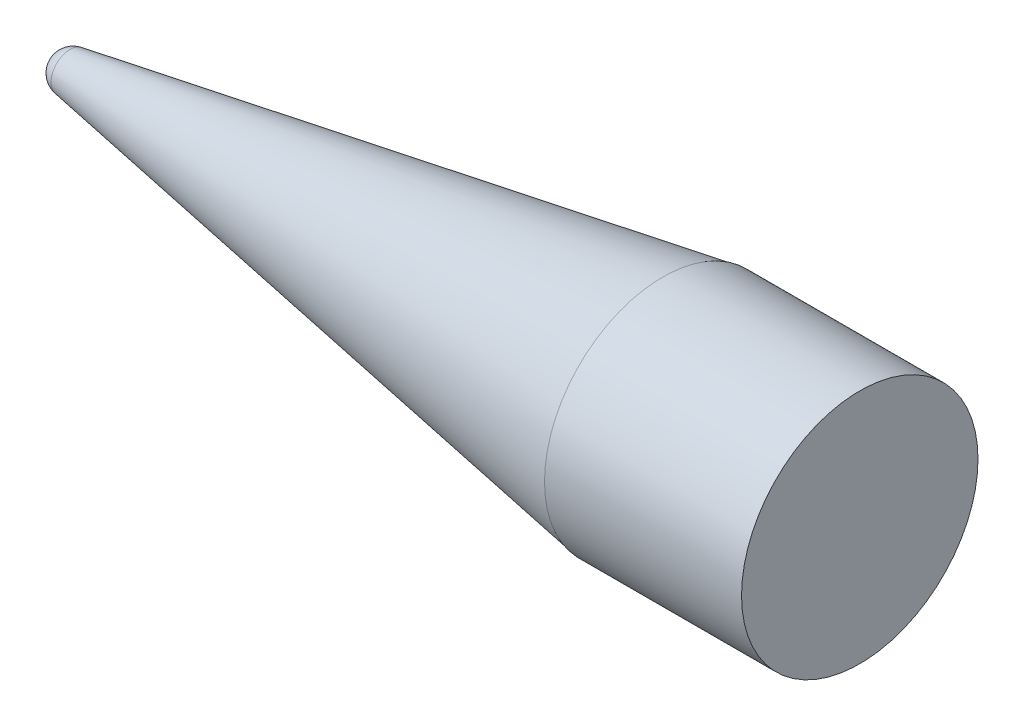
ISO-10303-21;
HEADER;
FILE_DESCRIPTION(('STEP AP214'),'2;1');
FILE_NAME('part.step','',(''),(''),'','','');
FILE_SCHEMA(('AUTOMOTIVE_DESIGN { 1 0 10303 214 1 1 1 1 }'));
ENDSEC;
DATA;
#1=APPLICATION_CONTEXT('core data for automotive mechanical design processes');
#2=APPLICATION_PROTOCOL_DEFINITION('international standard','automotive_design',2000,#1);
#3=PRODUCT_CONTEXT('',#1,'mechanical');
#4=PRODUCT('Part','Part','',(#3));
#5=PRODUCT_RELATED_PRODUCT_CATEGORY('part','',(#4));
#6=PRODUCT_DEFINITION_FORMATION('','',#4);
#7=PRODUCT_DEFINITION_CONTEXT('part definition',#1,'design');
#8=PRODUCT_DEFINITION('design','',#6,#7);
#9=PRODUCT_DEFINITION_SHAPE('','',#8);
#10=(LENGTH_UNIT() NAMED_UNIT(*) SI_UNIT(.MILLI.,.METRE.));
#11=(NAMED_UNIT(*) PLANE_ANGLE_UNIT() SI_UNIT($,.RADIAN.));
#12=(NAMED_UNIT(*) SI_UNIT($,.STERADIAN.) SOLID_ANGLE_UNIT());
#13=UNCERTAINTY_MEASURE_WITH_UNIT(LENGTH_MEASURE(1.E-05),#10,'distance_accuracy_value','');
#14=(GEOMETRIC_REPRESENTATION_CONTEXT(3) GLOBAL_UNCERTAINTY_ASSIGNED_CONTEXT((#13)) GLOBAL_UNIT_ASSIGNED_CONTEXT((#10,
#11,#12)) REPRESENTATION_CONTEXT('',''));
#15=CARTESIAN_POINT('',(0.,0.,0.));
#16=DIRECTION('',(0.,0.,1.));
#17=DIRECTION('',(1.,0.,0.));
#18=AXIS2_PLACEMENT_3D('',#15,#16,#17);
#19=CARTESIAN_POINT('',(457.256428842994,0.,0.));
#20=DIRECTION('',(1.,0.,0.));
#21=DIRECTION('',(0.,0.,-1.));
#22=AXIS2_PLACEMENT_3D('',#19,#20,#21);
#23=CONICAL_SURFACE('',#22,75.8614269420357,0.165148677414627);
#24=CARTESIAN_POINT('',(75.2196458427324,0.,0.));
#25=DIRECTION('',(-1.,0.,0.));
#26=DIRECTION('',(0.,0.,1.));
#27=AXIS2_PLACEMENT_3D('',#24,#25,#26);
#28=CIRCLE('',#27,12.1886297753254);
#29=CARTESIAN_POINT('',(75.2196458427325,0.,-12.1886297753254));
#30=VERTEX_POINT('',#29);
#31=EDGE_CURVE('E10',#30,#30,#28,.T.);
#32=CARTESIAN_POINT('',(457.256428842994,0.,0.));
#33=DIRECTION('',(-1.,0.,0.));
#34=DIRECTION('',(0.,0.,1.));
#35=AXIS2_PLACEMENT_3D('',#32,#33,#34);
#36=CIRCLE('',#35,75.8614269420357);
#37=CARTESIAN_POINT('',(457.256428842994,0.,-75.8614269420357));
#38=VERTEX_POINT('',#37);
#39=EDGE_CURVE('E37',#38,#38,#36,.T.);
#40=CARTESIAN_POINT('',(75.2196458427325,0.,-12.1886297753254));
#41=CARTESIAN_POINT('',(79.1991956656519,0.,-12.8518880791453));
#42=CARTESIAN_POINT('',(83.1787454885713,0.,-13.5151463829652));
#43=CARTESIAN_POINT('',(91.13784513441,0.,-14.841662990605));
#44=CARTESIAN_POINT('',(95.1173949573295,0.,-15.5049212944249));
#45=CARTESIAN_POINT('',(103.076494603168,0.,-16.8314379020647));
#46=CARTESIAN_POINT('',(107.056044426088,0.,-17.4946962058846));
#47=CARTESIAN_POINT('',(115.015144071926,0.,-18.8212128135244));
#48=CARTESIAN_POINT('',(118.994693894846,0.,-19.4844711173443));
#49=CARTESIAN_POINT('',(126.953793540685,0.,-20.8109877249841));
#50=CARTESIAN_POINT('',(130.933343363604,0.,-21.474246028804));
#51=CARTESIAN_POINT('',(138.892443009443,0.,-22.8007626364438));
#52=CARTESIAN_POINT('',(142.871992832362,0.,-23.4640209402637));
#53=CARTESIAN_POINT('',(150.831092478201,0.,-24.7905375479035));
#54=CARTESIAN_POINT('',(154.81064230112,0.,-25.4537958517234));
#55=CARTESIAN_POINT('',(162.769741946959,0.,-26.7803124593632));
#56=CARTESIAN_POINT('',(166.749291769878,0.,-27.4435707631831));
#57=CARTESIAN_POINT('',(174.708391415717,0.,-28.7700873708229));
#58=CARTESIAN_POINT('',(178.687941238637,0.,-29.4333456746428));
#59=CARTESIAN_POINT('',(186.647040884475,0.,-30.7598622822826));
#60=CARTESIAN_POINT('',(190.626590707395,0.,-31.4231205861025));
#61=CARTESIAN_POINT('',(198.585690353234,0.,-32.7496371937423));
#62=CARTESIAN_POINT('',(202.565240176153,0.,-33.4128954975622));
#63=CARTESIAN_POINT('',(210.524339821992,0.,-34.739412105202));
#64=CARTESIAN_POINT('',(214.503889644911,0.,-35.4026704090219));
#65=CARTESIAN_POINT('',(222.46298929075,0.,-36.7291870166617));
#66=CARTESIAN_POINT('',(226.442539113669,0.,-37.3924453204816));
#67=CARTESIAN_POINT('',(234.401638759508,0.,-38.7189619281214));
#68=CARTESIAN_POINT('',(238.381188582428,0.,-39.3822202319413));
#69=CARTESIAN_POINT('',(246.340288228266,0.,-40.7087368395811));
#70=CARTESIAN_POINT('',(250.319838051186,0.,-41.371995143401));
#71=CARTESIAN_POINT('',(258.278937697025,0.,-42.6985117510408));
#72=CARTESIAN_POINT('',(262.258487519944,0.,-43.3617700548606));
#73=CARTESIAN_POINT('',(270.217587165783,0.,-44.6882866625004));
#74=CARTESIAN_POINT('',(274.197136988702,0.,-45.3515449663203));
#75=CARTESIAN_POINT('',(282.156236634541,0.,-46.6780615739601));
#76=CARTESIAN_POINT('',(286.13578645746,0.,-47.34131987778));
#77=CARTESIAN_POINT('',(294.094886103299,0.,-48.6678364854198));
#78=CARTESIAN_POINT('',(298.074435926218,0.,-49.3310947892397));
#79=CARTESIAN_POINT('',(306.033535572057,0.,-50.6576113968795));
#80=CARTESIAN_POINT('',(310.013085394977,0.,-51.3208697006994));
#81=CARTESIAN_POINT('',(317.972185040815,0.,-52.6473863083392));
#82=CARTESIAN_POINT('',(321.951734863735,0.,-53.3106446121591));
#83=CARTESIAN_POINT('',(329.910834509574,0.,-54.6371612197989));
#84=CARTESIAN_POINT('',(333.890384332493,0.,-55.3004195236188));
#85=CARTESIAN_POINT('',(341.849483978332,0.,-56.6269361312586));
#86=CARTESIAN_POINT('',(345.829033801251,0.,-57.2901944350785));
#87=CARTESIAN_POINT('',(353.78813344709,0.,-58.6167110427183));
#88=CARTESIAN_POINT('',(357.767683270009,0.,-59.2799693465382));
#89=CARTESIAN_POINT('',(365.726782915848,0.,-60.606485954178));
#90=CARTESIAN_POINT('',(369.706332738767,0.,-61.2697442579979));
#91=CARTESIAN_POINT('',(377.665432384606,0.,-62.5962608656377));
#92=CARTESIAN_POINT('',(381.644982207526,0.,-63.2595191694576));
#93=CARTESIAN_POINT('',(389.604081853364,0.,-64.5860357770974));
#94=CARTESIAN_POINT('',(393.583631676284,0.,-65.2492940809173));
#95=CARTESIAN_POINT('',(401.542731322123,0.,-66.5758106885571));
#96=CARTESIAN_POINT('',(405.522281145042,0.,-67.239068992377));
#97=CARTESIAN_POINT('',(413.481380790881,0.,-68.5655856000168));
#98=CARTESIAN_POINT('',(417.4609306138,0.,-69.2288439038367));
#99=CARTESIAN_POINT('',(425.420030259639,0.,-70.5553605114765));
#100=CARTESIAN_POINT('',(429.399580082558,0.,-71.2186188152964));
#101=CARTESIAN_POINT('',(437.358679728397,0.,-72.5451354229362));
#102=CARTESIAN_POINT('',(441.338229551317,0.,-73.2083937267561));
#103=CARTESIAN_POINT('',(449.297329197155,0.,-74.5349103343959));
#104=CARTESIAN_POINT('',(453.276879020075,0.,-75.1981686382157));
#105=CARTESIAN_POINT('',(457.256428842994,0.,-75.8614269420357));
#106=B_SPLINE_CURVE_WITH_KNOTS('',3,(#40,#41,#42,#43,#44,#45,#46,#47,#48,#49,#50,#51,#52,#53,
#54,#55,#56,#57,#58,#59,#60,#61,#62,#63,#64,#65,#66,#67,#68,#69,#70,#71,#72,#73,#74,#75,#76,#77,
#78,#79,#80,#81,#82,#83,#84,#85,#86,#87,#88,#89,#90,#91,#92,#93,#94,#95,#96,#97,#98,#99,#100,
#101,#102,#103,#104,#105),.UNSPECIFIED.,.F.,.F.,(4,2,2,2,2,2,2,2,2,2,2,2,2,2,2,2,2,2,2,2,2,2,2,
2,2,2,2,2,2,2,2,2,4),(0.,12.1033282751545,24.206656550309,36.3099848254635,48.4133131006179,
60.5166413757725,72.619969650927,84.7232979260815,96.826626201236,108.92995447639,
121.033282751545,133.136611026699,145.239939301854,157.343267577008,169.446595852163,
181.549924127317,193.653252402472,205.756580677626,217.859908952781,229.963237227935,
242.06656550309,254.169893778244,266.273222053399,278.376550328553,290.479878603708,
302.583206878862,314.686535154017,326.789863429171,338.893191704326,350.99651997948,
363.099848254635,375.203176529789,387.306504804944),.UNSPECIFIED.);
#107=EDGE_CURVE('BSEAM31',#30,#38,#106,.T.);
#108=ORIENTED_EDGE('',*,*,#31,.F.);
#109=ORIENTED_EDGE('',*,*,#39,.T.);
#110=ORIENTED_EDGE('',*,*,#107,.T.);
#111=ORIENTED_EDGE('',*,*,#107,.F.);
#112=EDGE_LOOP('',(#108,#110,#109,#111));
#113=FACE_BOUND('',#112,.T.);
#114=ADVANCED_FACE('F31',(#113),#23,.T.);
#115=CARTESIAN_POINT('',(77.25108413862,0.,0.));
#116=DIRECTION('',(-1.,0.,0.));
#117=DIRECTION('',(0.,0.,-1.));
#118=AXIS2_PLACEMENT_3D('',#115,#116,#117);
#119=SPHERICAL_SURFACE('',#118,12.3567567488378);
#120=ORIENTED_EDGE('',*,*,#31,.T.);
#121=EDGE_LOOP('',(#120));
#122=FACE_BOUND('',#121,.T.);
#123=ADVANCED_FACE('F65',(#122),#119,.T.);
#124=CARTESIAN_POINT('',(584.256428842994,0.,0.));
#125=DIRECTION('',(-1.,0.,0.));
#126=DIRECTION('',(0.,0.,1.));
#127=AXIS2_PLACEMENT_3D('',#124,#125,#126);
#128=CYLINDRICAL_SURFACE('',#127,76.2);
#129=CARTESIAN_POINT('',(584.256428842994,0.,0.));
#130=DIRECTION('',(1.,0.,0.));
#131=DIRECTION('',(0.,0.,-1.));
#132=AXIS2_PLACEMENT_3D('',#129,#130,#131);
#133=CIRCLE('',#132,76.2);
#134=CARTESIAN_POINT('',(584.256428842994,0.,-76.2));
#135=VERTEX_POINT('',#134);
#136=EDGE_CURVE('E41',#135,#135,#133,.T.);
#137=ORIENTED_EDGE('',*,*,#136,.F.);
#138=EDGE_LOOP('',(#137));
#139=FACE_BOUND('',#138,.T.);
#140=CARTESIAN_POINT('',(457.256428842994,0.,0.));
#141=DIRECTION('',(1.,0.,0.));
#142=DIRECTION('',(0.,0.,-1.));
#143=AXIS2_PLACEMENT_3D('',#140,#141,#142);
#144=CIRCLE('',#143,76.2);
#145=CARTESIAN_POINT('',(457.256428842994,0.,-76.2));
#146=VERTEX_POINT('',#145);
#147=EDGE_CURVE('E45',#146,#146,#144,.T.);
#148=ORIENTED_EDGE('',*,*,#147,.T.);
#149=EDGE_LOOP('',(#148));
#150=FACE_BOUND('',#149,.T.);
#151=ADVANCED_FACE('F51',(#139,#150),#128,.T.);
#152=CARTESIAN_POINT('',(584.256428842994,0.,0.));
#153=DIRECTION('',(1.,0.,0.));
#154=DIRECTION('',(0.,0.,-1.));
#155=AXIS2_PLACEMENT_3D('',#152,#153,#154);
#156=PLANE('',#155);
#157=ORIENTED_EDGE('',*,*,#136,.T.);
#158=EDGE_LOOP('',(#157));
#159=FACE_BOUND('',#158,.T.);
#160=ADVANCED_FACE('F55',(#159),#156,.T.);
#161=CARTESIAN_POINT('',(457.256428842994,0.,0.));
#162=DIRECTION('',(1.,0.,0.));
#163=DIRECTION('',(0.,0.,-1.));
#164=AXIS2_PLACEMENT_3D('',#161,#162,#163);
#165=PLANE('',#164);
#166=ORIENTED_EDGE('',*,*,#39,.F.);
#167=EDGE_LOOP('',(#166));
#168=FACE_BOUND('',#167,.T.);
#169=ORIENTED_EDGE('',*,*,#147,.F.);
#170=EDGE_LOOP('',(#169));
#171=FACE_BOUND('',#170,.T.);
#172=ADVANCED_FACE('F53',(#168,#171),#165,.F.);
#173=CLOSED_SHELL('',(#114,#123,#151,#160,#172));
#174=MANIFOLD_SOLID_BREP('B2',#173);
#175=ADVANCED_BREP_SHAPE_REPRESENTATION('',(#18,#174),#14);
#176=SHAPE_DEFINITION_REPRESENTATION(#9,#175);
ENDSEC;
END-ISO-10303-21;
